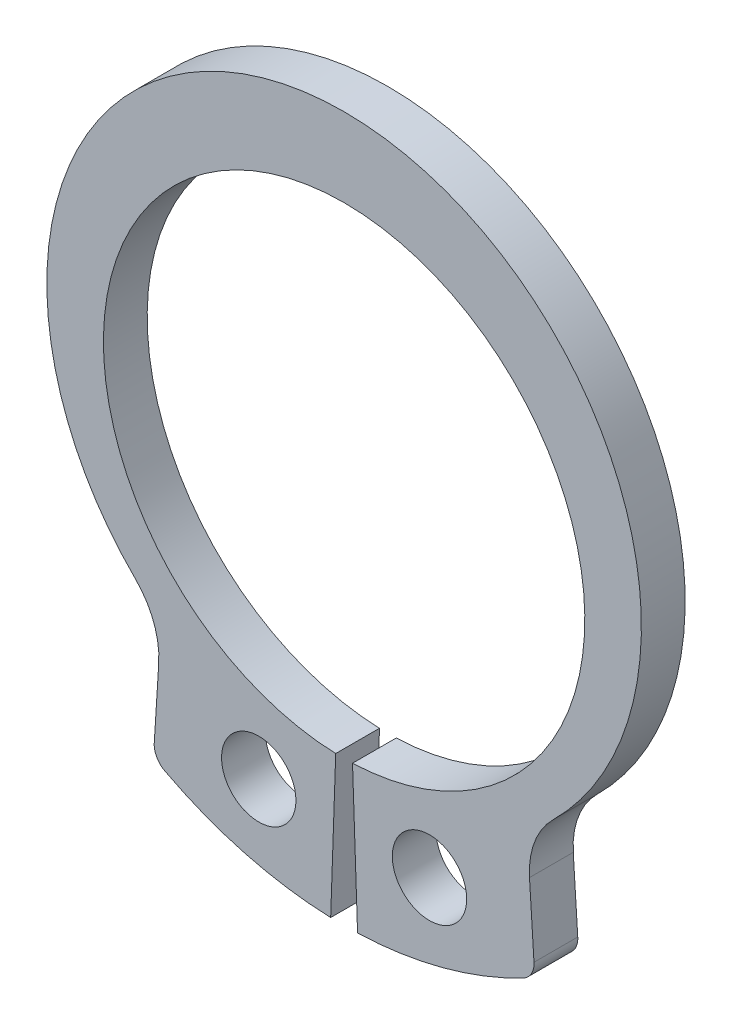
ISO-10303-21;
HEADER;
FILE_DESCRIPTION(('STEP AP214'),'2;1');
FILE_NAME('part.step','',(''),(''),'','','');
FILE_SCHEMA(('AUTOMOTIVE_DESIGN { 1 0 10303 214 1 1 1 1 }'));
ENDSEC;
DATA;
#1=APPLICATION_CONTEXT('core data for automotive mechanical design processes');
#2=APPLICATION_PROTOCOL_DEFINITION('international standard','automotive_design',2000,#1);
#3=PRODUCT_CONTEXT('',#1,'mechanical');
#4=PRODUCT('Part','Part','',(#3));
#5=PRODUCT_RELATED_PRODUCT_CATEGORY('part','',(#4));
#6=PRODUCT_DEFINITION_FORMATION('','',#4);
#7=PRODUCT_DEFINITION_CONTEXT('part definition',#1,'design');
#8=PRODUCT_DEFINITION('design','',#6,#7);
#9=PRODUCT_DEFINITION_SHAPE('','',#8);
#10=(LENGTH_UNIT() NAMED_UNIT(*) SI_UNIT(.MILLI.,.METRE.));
#11=(NAMED_UNIT(*) PLANE_ANGLE_UNIT() SI_UNIT($,.RADIAN.));
#12=(NAMED_UNIT(*) SI_UNIT($,.STERADIAN.) SOLID_ANGLE_UNIT());
#13=UNCERTAINTY_MEASURE_WITH_UNIT(LENGTH_MEASURE(1.E-05),#10,'distance_accuracy_value','');
#14=(GEOMETRIC_REPRESENTATION_CONTEXT(3) GLOBAL_UNCERTAINTY_ASSIGNED_CONTEXT((#13)) GLOBAL_UNIT_ASSIGNED_CONTEXT((#10,
#11,#12)) REPRESENTATION_CONTEXT('',''));
#15=CARTESIAN_POINT('',(0.,0.,0.));
#16=DIRECTION('',(0.,0.,1.));
#17=DIRECTION('',(1.,0.,0.));
#18=AXIS2_PLACEMENT_3D('',#15,#16,#17);
#19=CARTESIAN_POINT('',(0.,0.507545005992357,0.5));
#20=DIRECTION('',(0.,0.,1.));
#21=DIRECTION('',(1.,0.,0.));
#22=AXIS2_PLACEMENT_3D('',#19,#20,#21);
#23=PLANE('',#22);
#24=DIRECTION('',(-0.0629534404343196,-0.99801646496312,0.));
#25=VECTOR('',#24,1.);
#26=CARTESIAN_POINT('',(-4.3566053068115,-7.65208632949539,0.5));
#27=LINE('',#26,#25);
#28=CARTESIAN_POINT('',(-4.23583263948221,-5.73744735693751,0.5));
#29=VERTEX_POINT('',#28);
#30=CARTESIAN_POINT('',(-4.33832534093224,-7.36228950821608,0.5));
#31=VERTEX_POINT('',#30);
#32=EDGE_CURVE('E194',#29,#31,#27,.T.);
#33=ORIENTED_EDGE('',*,*,#32,.T.);
#34=CARTESIAN_POINT('',(-3.8826661637093,-7.39103183249498,0.5));
#35=DIRECTION('',(0.,0.,1.));
#36=DIRECTION('',(1.,0.,0.));
#37=AXIS2_PLACEMENT_3D('',#34,#35,#36);
#38=CIRCLE('',#37,0.456564789479484);
#39=CARTESIAN_POINT('',(-4.09499474140209,-7.79521988537062,0.5));
#40=VERTEX_POINT('',#39);
#41=EDGE_CURVE('E12',#31,#40,#38,.T.);
#42=ORIENTED_EDGE('',*,*,#41,.T.);
#43=CARTESIAN_POINT('',(0.,0.,0.5));
#44=DIRECTION('',(0.,0.,1.));
#45=DIRECTION('',(1.,0.,0.));
#46=AXIS2_PLACEMENT_3D('',#43,#44,#45);
#47=CIRCLE('',#46,8.80536398982963);
#48=CARTESIAN_POINT('',(-0.307302771527386,-8.8,0.5));
#49=VERTEX_POINT('',#48);
#50=EDGE_CURVE('E197',#40,#49,#47,.T.);
#51=ORIENTED_EDGE('',*,*,#50,.T.);
#52=DIRECTION('',(0.0348994967025,0.999390827019096,0.));
#53=VECTOR('',#52,1.);
#54=CARTESIAN_POINT('',(-0.307302771527386,-8.8,0.5));
#55=LINE('',#54,#53);
#56=CARTESIAN_POINT('',(-0.191947231863764,-5.49664954860503,0.5));
#57=VERTEX_POINT('',#56);
#58=EDGE_CURVE('E199',#49,#57,#55,.T.);
#59=ORIENTED_EDGE('',*,*,#58,.T.);
#60=CARTESIAN_POINT('',(0.,0.,0.5));
#61=DIRECTION('',(0.,0.,-1.));
#62=DIRECTION('',(1.,0.,0.));
#63=AXIS2_PLACEMENT_3D('',#60,#61,#62);
#64=CIRCLE('',#63,5.5);
#65=CARTESIAN_POINT('',(0.191947231863761,-5.49664954860503,0.5));
#66=VERTEX_POINT('',#65);
#67=EDGE_CURVE('E153',#57,#66,#64,.T.);
#68=ORIENTED_EDGE('',*,*,#67,.T.);
#69=DIRECTION('',(-0.0348994967024995,0.999390827019096,0.));
#70=VECTOR('',#69,1.);
#71=CARTESIAN_POINT('',(0.307302771527382,-8.8,0.5));
#72=LINE('',#71,#70);
#73=CARTESIAN_POINT('',(0.307302771527382,-8.8,0.5));
#74=VERTEX_POINT('',#73);
#75=EDGE_CURVE('E133',#74,#66,#72,.T.);
#76=ORIENTED_EDGE('',*,*,#75,.F.);
#77=CARTESIAN_POINT('',(0.,0.,0.5));
#78=DIRECTION('',(0.,0.,-1.));
#79=DIRECTION('',(-1.,0.,0.));
#80=AXIS2_PLACEMENT_3D('',#77,#78,#79);
#81=CIRCLE('',#80,8.80536398982963);
#82=CARTESIAN_POINT('',(4.09499474140209,-7.79521988537062,0.5));
#83=VERTEX_POINT('',#82);
#84=EDGE_CURVE('E143',#83,#74,#81,.T.);
#85=ORIENTED_EDGE('',*,*,#84,.F.);
#86=CARTESIAN_POINT('',(3.8826661637093,-7.39103183249498,0.5));
#87=DIRECTION('',(0.,0.,-1.));
#88=DIRECTION('',(-1.,0.,0.));
#89=AXIS2_PLACEMENT_3D('',#86,#87,#88);
#90=CIRCLE('',#89,0.456564789479484);
#91=CARTESIAN_POINT('',(4.33832534093224,-7.36228950821608,0.5));
#92=VERTEX_POINT('',#91);
#93=EDGE_CURVE('E182',#92,#83,#90,.T.);
#94=ORIENTED_EDGE('',*,*,#93,.F.);
#95=DIRECTION('',(0.0629534404343192,-0.99801646496312,0.));
#96=VECTOR('',#95,1.);
#97=CARTESIAN_POINT('',(4.3566053068115,-7.65208632949539,0.5));
#98=LINE('',#97,#96);
#99=CARTESIAN_POINT('',(4.2358326394822,-5.73744735693751,0.5));
#100=VERTEX_POINT('',#99);
#101=EDGE_CURVE('E149',#100,#92,#98,.T.);
#102=ORIENTED_EDGE('',*,*,#101,.F.);
#103=CARTESIAN_POINT('',(6.05846934837399,-5.6224780598219,0.5));
#104=DIRECTION('',(0.,0.,-1.));
#105=DIRECTION('',(-1.,0.,0.));
#106=AXIS2_PLACEMENT_3D('',#103,#104,#105);
#107=CIRCLE('',#106,1.82625915791794);
#108=CARTESIAN_POINT('',(4.77471228956015,-4.32355915325968,0.5));
#109=VERTEX_POINT('',#108);
#110=EDGE_CURVE('E173',#109,#100,#107,.F.);
#111=ORIENTED_EDGE('',*,*,#110,.F.);
#112=CARTESIAN_POINT('',(0.,0.507545005992357,0.5));
#113=DIRECTION('',(0.,0.,1.));
#114=DIRECTION('',(1.,0.,0.));
#115=AXIS2_PLACEMENT_3D('',#112,#113,#114);
#116=CIRCLE('',#115,6.79245499400762);
#117=CARTESIAN_POINT('',(-4.77471228956016,-4.32355915325968,0.5));
#118=VERTEX_POINT('',#117);
#119=EDGE_CURVE('E191',#109,#118,#116,.T.);
#120=ORIENTED_EDGE('',*,*,#119,.T.);
#121=CARTESIAN_POINT('',(-6.05846934837399,-5.6224780598219,0.5));
#122=DIRECTION('',(0.,0.,1.));
#123=DIRECTION('',(1.,0.,0.));
#124=AXIS2_PLACEMENT_3D('',#121,#122,#123);
#125=CIRCLE('',#124,1.82625915791794);
#126=EDGE_CURVE('E224',#118,#29,#125,.F.);
#127=ORIENTED_EDGE('',*,*,#126,.T.);
#128=EDGE_LOOP('',(#33,#42,#51,#59,#68,#76,#85,#94,#102,#111,#120,#127));
#129=FACE_BOUND('',#128,.T.);
#130=CARTESIAN_POINT('',(-1.95080113253433,-6.88151398034483,0.5));
#131=DIRECTION('',(0.,0.,1.));
#132=DIRECTION('',(1.,0.,0.));
#133=AXIS2_PLACEMENT_3D('',#130,#131,#132);
#134=CIRCLE('',#133,0.85);
#135=CARTESIAN_POINT('',(-1.10080113253433,-6.88151398034483,0.5));
#136=VERTEX_POINT('',#135);
#137=EDGE_CURVE('E185',#136,#136,#134,.T.);
#138=ORIENTED_EDGE('',*,*,#137,.F.);
#139=EDGE_LOOP('',(#138));
#140=FACE_BOUND('',#139,.T.);
#141=CARTESIAN_POINT('',(1.95080113253433,-6.88151398034483,0.5));
#142=DIRECTION('',(0.,0.,-1.));
#143=DIRECTION('',(-1.,0.,0.));
#144=AXIS2_PLACEMENT_3D('',#141,#142,#143);
#145=CIRCLE('',#144,0.85);
#146=CARTESIAN_POINT('',(1.10080113253433,-6.88151398034483,0.5));
#147=VERTEX_POINT('',#146);
#148=EDGE_CURVE('E163',#147,#147,#145,.T.);
#149=ORIENTED_EDGE('',*,*,#148,.T.);
#150=EDGE_LOOP('',(#149));
#151=FACE_BOUND('',#150,.T.);
#152=ADVANCED_FACE('F39',(#129,#140,#151),#23,.T.);
#153=CARTESIAN_POINT('',(0.,0.507545005992357,-0.5));
#154=DIRECTION('',(0.,0.,1.));
#155=DIRECTION('',(1.,0.,0.));
#156=AXIS2_PLACEMENT_3D('',#153,#154,#155);
#157=PLANE('',#156);
#158=CARTESIAN_POINT('',(0.,0.,-0.5));
#159=DIRECTION('',(0.,0.,1.));
#160=DIRECTION('',(1.,0.,0.));
#161=AXIS2_PLACEMENT_3D('',#158,#159,#160);
#162=CIRCLE('',#161,8.80536398982963);
#163=CARTESIAN_POINT('',(-4.09499474140209,-7.79521988537062,-0.5));
#164=VERTEX_POINT('',#163);
#165=CARTESIAN_POINT('',(-0.307302771527386,-8.8,-0.5));
#166=VERTEX_POINT('',#165);
#167=EDGE_CURVE('E207',#164,#166,#162,.T.);
#168=ORIENTED_EDGE('',*,*,#167,.F.);
#169=CARTESIAN_POINT('',(-3.8826661637093,-7.39103183249498,-0.5));
#170=DIRECTION('',(0.,0.,1.));
#171=DIRECTION('',(1.,0.,0.));
#172=AXIS2_PLACEMENT_3D('',#169,#170,#171);
#173=CIRCLE('',#172,0.456564789479484);
#174=CARTESIAN_POINT('',(-4.33832534093224,-7.36228950821608,-0.5));
#175=VERTEX_POINT('',#174);
#176=EDGE_CURVE('E61',#164,#175,#173,.F.);
#177=ORIENTED_EDGE('',*,*,#176,.T.);
#178=DIRECTION('',(-0.0629534404343196,-0.99801646496312,0.));
#179=VECTOR('',#178,1.);
#180=CARTESIAN_POINT('',(-4.3566053068115,-7.65208632949539,-0.5));
#181=LINE('',#180,#179);
#182=CARTESIAN_POINT('',(-4.23583263948221,-5.73744735693751,-0.5));
#183=VERTEX_POINT('',#182);
#184=EDGE_CURVE('E205',#183,#175,#181,.T.);
#185=ORIENTED_EDGE('',*,*,#184,.F.);
#186=CARTESIAN_POINT('',(-6.05846934837399,-5.6224780598219,-0.5));
#187=DIRECTION('',(0.,0.,1.));
#188=DIRECTION('',(1.,0.,0.));
#189=AXIS2_PLACEMENT_3D('',#186,#187,#188);
#190=CIRCLE('',#189,1.82625915791794);
#191=CARTESIAN_POINT('',(-4.77471228956016,-4.32355915325968,-0.5));
#192=VERTEX_POINT('',#191);
#193=EDGE_CURVE('E222',#183,#192,#190,.T.);
#194=ORIENTED_EDGE('',*,*,#193,.T.);
#195=CARTESIAN_POINT('',(0.,0.507545005992357,-0.5));
#196=DIRECTION('',(0.,0.,1.));
#197=DIRECTION('',(1.,0.,0.));
#198=AXIS2_PLACEMENT_3D('',#195,#196,#197);
#199=CIRCLE('',#198,6.79245499400762);
#200=CARTESIAN_POINT('',(4.77471228956015,-4.32355915325968,-0.5));
#201=VERTEX_POINT('',#200);
#202=EDGE_CURVE('E188',#201,#192,#199,.T.);
#203=ORIENTED_EDGE('',*,*,#202,.F.);
#204=CARTESIAN_POINT('',(6.05846934837399,-5.6224780598219,-0.5));
#205=DIRECTION('',(0.,0.,-1.));
#206=DIRECTION('',(-1.,0.,0.));
#207=AXIS2_PLACEMENT_3D('',#204,#205,#206);
#208=CIRCLE('',#207,1.82625915791794);
#209=CARTESIAN_POINT('',(4.2358326394822,-5.73744735693751,-0.5));
#210=VERTEX_POINT('',#209);
#211=EDGE_CURVE('E170',#210,#201,#208,.T.);
#212=ORIENTED_EDGE('',*,*,#211,.F.);
#213=DIRECTION('',(0.0629534404343192,-0.99801646496312,0.));
#214=VECTOR('',#213,1.);
#215=CARTESIAN_POINT('',(4.3566053068115,-7.65208632949539,-0.5));
#216=LINE('',#215,#214);
#217=CARTESIAN_POINT('',(4.33832534093224,-7.36228950821608,-0.5));
#218=VERTEX_POINT('',#217);
#219=EDGE_CURVE('E159',#210,#218,#216,.T.);
#220=ORIENTED_EDGE('',*,*,#219,.T.);
#221=CARTESIAN_POINT('',(3.8826661637093,-7.39103183249498,-0.5));
#222=DIRECTION('',(0.,0.,-1.));
#223=DIRECTION('',(-1.,0.,0.));
#224=AXIS2_PLACEMENT_3D('',#221,#222,#223);
#225=CIRCLE('',#224,0.456564789479484);
#226=CARTESIAN_POINT('',(4.09499474140209,-7.79521988537062,-0.5));
#227=VERTEX_POINT('',#226);
#228=EDGE_CURVE('E177',#227,#218,#225,.F.);
#229=ORIENTED_EDGE('',*,*,#228,.F.);
#230=CARTESIAN_POINT('',(0.,0.,-0.5));
#231=DIRECTION('',(0.,0.,-1.));
#232=DIRECTION('',(-1.,0.,0.));
#233=AXIS2_PLACEMENT_3D('',#230,#231,#232);
#234=CIRCLE('',#233,8.80536398982963);
#235=CARTESIAN_POINT('',(0.307302771527382,-8.8,-0.5));
#236=VERTEX_POINT('',#235);
#237=EDGE_CURVE('E162',#227,#236,#234,.T.);
#238=ORIENTED_EDGE('',*,*,#237,.T.);
#239=DIRECTION('',(-0.0348994967024995,0.999390827019096,0.));
#240=VECTOR('',#239,1.);
#241=CARTESIAN_POINT('',(0.307302771527382,-8.8,-0.5));
#242=LINE('',#241,#240);
#243=CARTESIAN_POINT('',(0.191947231863761,-5.49664954860503,-0.5));
#244=VERTEX_POINT('',#243);
#245=EDGE_CURVE('E135',#236,#244,#242,.T.);
#246=ORIENTED_EDGE('',*,*,#245,.T.);
#247=CARTESIAN_POINT('',(0.,0.,-0.5));
#248=DIRECTION('',(0.,0.,-1.));
#249=DIRECTION('',(1.,0.,0.));
#250=AXIS2_PLACEMENT_3D('',#247,#248,#249);
#251=CIRCLE('',#250,5.5);
#252=CARTESIAN_POINT('',(-0.191947231863764,-5.49664954860503,-0.5));
#253=VERTEX_POINT('',#252);
#254=EDGE_CURVE('E195',#253,#244,#251,.T.);
#255=ORIENTED_EDGE('',*,*,#254,.F.);
#256=DIRECTION('',(0.0348994967025,0.999390827019096,0.));
#257=VECTOR('',#256,1.);
#258=CARTESIAN_POINT('',(-0.307302771527386,-8.8,-0.5));
#259=LINE('',#258,#257);
#260=EDGE_CURVE('E209',#166,#253,#259,.T.);
#261=ORIENTED_EDGE('',*,*,#260,.F.);
#262=EDGE_LOOP('',(#168,#177,#185,#194,#203,#212,#220,#229,#238,#246,#255,#261));
#263=FACE_BOUND('',#262,.T.);
#264=CARTESIAN_POINT('',(-1.95080113253433,-6.88151398034483,-0.5));
#265=DIRECTION('',(0.,0.,1.));
#266=DIRECTION('',(1.,0.,0.));
#267=AXIS2_PLACEMENT_3D('',#264,#265,#266);
#268=CIRCLE('',#267,0.85);
#269=CARTESIAN_POINT('',(-1.10080113253433,-6.88151398034483,-0.5));
#270=VERTEX_POINT('',#269);
#271=EDGE_CURVE('E184',#270,#270,#268,.T.);
#272=ORIENTED_EDGE('',*,*,#271,.T.);
#273=EDGE_LOOP('',(#272));
#274=FACE_BOUND('',#273,.T.);
#275=CARTESIAN_POINT('',(1.95080113253433,-6.88151398034483,-0.5));
#276=DIRECTION('',(0.,0.,-1.));
#277=DIRECTION('',(-1.,0.,0.));
#278=AXIS2_PLACEMENT_3D('',#275,#276,#277);
#279=CIRCLE('',#278,0.85);
#280=CARTESIAN_POINT('',(1.10080113253433,-6.88151398034483,-0.5));
#281=VERTEX_POINT('',#280);
#282=EDGE_CURVE('E257',#281,#281,#279,.T.);
#283=ORIENTED_EDGE('',*,*,#282,.F.);
#284=EDGE_LOOP('',(#283));
#285=FACE_BOUND('',#284,.T.);
#286=ADVANCED_FACE('F237',(#263,#274,#285),#157,.F.);
#287=CARTESIAN_POINT('',(0.,0.507545005992357,0.5));
#288=DIRECTION('',(0.,0.,-1.));
#289=DIRECTION('',(-1.,0.,0.));
#290=AXIS2_PLACEMENT_3D('',#287,#288,#289);
#291=CYLINDRICAL_SURFACE('',#290,6.79245499400762);
#292=ORIENTED_EDGE('',*,*,#202,.T.);
#293=DIRECTION('',(0.,0.,-1.));
#294=VECTOR('',#293,1.);
#295=CARTESIAN_POINT('',(-4.77471228956016,-4.32355915325968,0.5));
#296=LINE('',#295,#294);
#297=EDGE_CURVE('E220',#192,#118,#296,.F.);
#298=ORIENTED_EDGE('',*,*,#297,.T.);
#299=ORIENTED_EDGE('',*,*,#119,.F.);
#300=DIRECTION('',(0.,0.,-1.));
#301=VECTOR('',#300,1.);
#302=CARTESIAN_POINT('',(4.77471228956015,-4.32355915325968,0.5));
#303=LINE('',#302,#301);
#304=EDGE_CURVE('E167',#201,#109,#303,.F.);
#305=ORIENTED_EDGE('',*,*,#304,.F.);
#306=EDGE_LOOP('',(#292,#298,#299,#305));
#307=FACE_BOUND('',#306,.T.);
#308=ADVANCED_FACE('F272',(#307),#291,.T.);
#309=CARTESIAN_POINT('',(-4.3566053068115,-7.65208632949539,0.5));
#310=DIRECTION('',(0.99801646496312,-0.0629534404343196,0.));
#311=DIRECTION('',(0.0629534404343196,0.99801646496312,0.));
#312=AXIS2_PLACEMENT_3D('',#309,#310,#311);
#313=PLANE('',#312);
#314=ORIENTED_EDGE('',*,*,#184,.T.);
#315=DIRECTION('',(0.,0.,-1.));
#316=VECTOR('',#315,1.);
#317=CARTESIAN_POINT('',(-4.33832534093224,-7.36228950821608,0.5));
#318=LINE('',#317,#316);
#319=EDGE_CURVE('E47',#175,#31,#318,.F.);
#320=ORIENTED_EDGE('',*,*,#319,.T.);
#321=ORIENTED_EDGE('',*,*,#32,.F.);
#322=DIRECTION('',(0.,0.,1.));
#323=VECTOR('',#322,1.);
#324=CARTESIAN_POINT('',(-4.23583263948221,-5.73744735693751,-0.5));
#325=LINE('',#324,#323);
#326=EDGE_CURVE('E217',#29,#183,#325,.F.);
#327=ORIENTED_EDGE('',*,*,#326,.T.);
#328=EDGE_LOOP('',(#314,#320,#321,#327));
#329=FACE_BOUND('',#328,.T.);
#330=ADVANCED_FACE('F278',(#329),#313,.F.);
#331=CARTESIAN_POINT('',(0.,0.,0.5));
#332=DIRECTION('',(0.,0.,-1.));
#333=DIRECTION('',(-1.,0.,0.));
#334=AXIS2_PLACEMENT_3D('',#331,#332,#333);
#335=CYLINDRICAL_SURFACE('',#334,8.80536398982963);
#336=ORIENTED_EDGE('',*,*,#50,.F.);
#337=DIRECTION('',(0.,0.,-1.));
#338=VECTOR('',#337,1.);
#339=CARTESIAN_POINT('',(-4.09499474140209,-7.79521988537062,0.5));
#340=LINE('',#339,#338);
#341=EDGE_CURVE('E226',#40,#164,#340,.T.);
#342=ORIENTED_EDGE('',*,*,#341,.T.);
#343=ORIENTED_EDGE('',*,*,#167,.T.);
#344=DIRECTION('',(0.,0.,-1.));
#345=VECTOR('',#344,1.);
#346=CARTESIAN_POINT('',(-0.307302771527386,-8.8,0.5));
#347=LINE('',#346,#345);
#348=EDGE_CURVE('E214',#49,#166,#347,.T.);
#349=ORIENTED_EDGE('',*,*,#348,.F.);
#350=EDGE_LOOP('',(#336,#342,#343,#349));
#351=FACE_BOUND('',#350,.T.);
#352=ADVANCED_FACE('F232',(#351),#335,.T.);
#353=CARTESIAN_POINT('',(-0.307302771527386,-8.8,0.5));
#354=DIRECTION('',(-0.999390827019096,0.0348994967025,0.));
#355=DIRECTION('',(-0.0348994967025,-0.999390827019096,0.));
#356=AXIS2_PLACEMENT_3D('',#353,#354,#355);
#357=PLANE('',#356);
#358=ORIENTED_EDGE('',*,*,#260,.T.);
#359=DIRECTION('',(0.,0.,-1.));
#360=VECTOR('',#359,1.);
#361=CARTESIAN_POINT('',(-0.191947231863764,-5.49664954860503,0.5));
#362=LINE('',#361,#360);
#363=EDGE_CURVE('E202',#57,#253,#362,.T.);
#364=ORIENTED_EDGE('',*,*,#363,.F.);
#365=ORIENTED_EDGE('',*,*,#58,.F.);
#366=ORIENTED_EDGE('',*,*,#348,.T.);
#367=EDGE_LOOP('',(#358,#364,#365,#366));
#368=FACE_BOUND('',#367,.T.);
#369=ADVANCED_FACE('F242',(#368),#357,.F.);
#370=CARTESIAN_POINT('',(0.,0.,0.5));
#371=DIRECTION('',(0.,0.,-1.));
#372=DIRECTION('',(-1.,0.,0.));
#373=AXIS2_PLACEMENT_3D('',#370,#371,#372);
#374=CYLINDRICAL_SURFACE('',#373,5.5);
#375=ORIENTED_EDGE('',*,*,#254,.T.);
#376=DIRECTION('',(0.,0.,-1.));
#377=VECTOR('',#376,1.);
#378=CARTESIAN_POINT('',(0.191947231863761,-5.49664954860503,0.5));
#379=LINE('',#378,#377);
#380=EDGE_CURVE('E140',#66,#244,#379,.T.);
#381=ORIENTED_EDGE('',*,*,#380,.F.);
#382=ORIENTED_EDGE('',*,*,#67,.F.);
#383=ORIENTED_EDGE('',*,*,#363,.T.);
#384=EDGE_LOOP('',(#375,#381,#382,#383));
#385=FACE_BOUND('',#384,.T.);
#386=ADVANCED_FACE('F245',(#385),#374,.F.);
#387=CARTESIAN_POINT('',(-1.95080113253433,-6.88151398034483,0.5));
#388=DIRECTION('',(0.,0.,-1.));
#389=DIRECTION('',(-1.,0.,0.));
#390=AXIS2_PLACEMENT_3D('',#387,#388,#389);
#391=CYLINDRICAL_SURFACE('',#390,0.85);
#392=ORIENTED_EDGE('',*,*,#137,.T.);
#393=EDGE_LOOP('',(#392));
#394=FACE_BOUND('',#393,.T.);
#395=ORIENTED_EDGE('',*,*,#271,.F.);
#396=EDGE_LOOP('',(#395));
#397=FACE_BOUND('',#396,.T.);
#398=ADVANCED_FACE('F286',(#394,#397),#391,.F.);
#399=CARTESIAN_POINT('',(-6.05846934837399,-5.6224780598219,0.5));
#400=DIRECTION('',(0.,0.,-1.));
#401=DIRECTION('',(-1.,0.,0.));
#402=AXIS2_PLACEMENT_3D('',#399,#400,#401);
#403=CYLINDRICAL_SURFACE('',#402,1.82625915791794);
#404=ORIENTED_EDGE('',*,*,#126,.F.);
#405=ORIENTED_EDGE('',*,*,#297,.F.);
#406=ORIENTED_EDGE('',*,*,#193,.F.);
#407=ORIENTED_EDGE('',*,*,#326,.F.);
#408=EDGE_LOOP('',(#404,#405,#406,#407));
#409=FACE_BOUND('',#408,.T.);
#410=ADVANCED_FACE('F292',(#409),#403,.F.);
#411=CARTESIAN_POINT('',(-3.8826661637093,-7.39103183249498,0.5));
#412=DIRECTION('',(0.,0.,-1.));
#413=DIRECTION('',(-1.,0.,0.));
#414=AXIS2_PLACEMENT_3D('',#411,#412,#413);
#415=CYLINDRICAL_SURFACE('',#414,0.456564789479484);
#416=ORIENTED_EDGE('',*,*,#41,.F.);
#417=ORIENTED_EDGE('',*,*,#319,.F.);
#418=ORIENTED_EDGE('',*,*,#176,.F.);
#419=ORIENTED_EDGE('',*,*,#341,.F.);
#420=EDGE_LOOP('',(#416,#417,#418,#419));
#421=FACE_BOUND('',#420,.T.);
#422=ADVANCED_FACE('F41',(#421),#415,.T.);
#423=CARTESIAN_POINT('',(4.3566053068115,-7.65208632949539,0.5));
#424=DIRECTION('',(-0.99801646496312,-0.0629534404343192,0.));
#425=DIRECTION('',(-0.0629534404343192,0.99801646496312,0.));
#426=AXIS2_PLACEMENT_3D('',#423,#424,#425);
#427=PLANE('',#426);
#428=ORIENTED_EDGE('',*,*,#219,.F.);
#429=DIRECTION('',(0.,0.,1.));
#430=VECTOR('',#429,1.);
#431=CARTESIAN_POINT('',(4.2358326394822,-5.73744735693751,-0.5));
#432=LINE('',#431,#430);
#433=EDGE_CURVE('E139',#100,#210,#432,.F.);
#434=ORIENTED_EDGE('',*,*,#433,.F.);
#435=ORIENTED_EDGE('',*,*,#101,.T.);
#436=DIRECTION('',(0.,0.,-1.));
#437=VECTOR('',#436,1.);
#438=CARTESIAN_POINT('',(4.33832534093224,-7.36228950821608,0.5));
#439=LINE('',#438,#437);
#440=EDGE_CURVE('E180',#218,#92,#439,.F.);
#441=ORIENTED_EDGE('',*,*,#440,.F.);
#442=EDGE_LOOP('',(#428,#434,#435,#441));
#443=FACE_BOUND('',#442,.T.);
#444=ADVANCED_FACE('F255',(#443),#427,.F.);
#445=CARTESIAN_POINT('',(0.,0.,0.5));
#446=DIRECTION('',(0.,0.,-1.));
#447=DIRECTION('',(1.,0.,0.));
#448=AXIS2_PLACEMENT_3D('',#445,#446,#447);
#449=CYLINDRICAL_SURFACE('',#448,8.80536398982963);
#450=ORIENTED_EDGE('',*,*,#84,.T.);
#451=DIRECTION('',(0.,0.,-1.));
#452=VECTOR('',#451,1.);
#453=CARTESIAN_POINT('',(0.307302771527382,-8.8,0.5));
#454=LINE('',#453,#452);
#455=EDGE_CURVE('E128',#74,#236,#454,.T.);
#456=ORIENTED_EDGE('',*,*,#455,.T.);
#457=ORIENTED_EDGE('',*,*,#237,.F.);
#458=DIRECTION('',(0.,0.,-1.));
#459=VECTOR('',#458,1.);
#460=CARTESIAN_POINT('',(4.09499474140209,-7.79521988537062,0.5));
#461=LINE('',#460,#459);
#462=EDGE_CURVE('E145',#83,#227,#461,.T.);
#463=ORIENTED_EDGE('',*,*,#462,.F.);
#464=EDGE_LOOP('',(#450,#456,#457,#463));
#465=FACE_BOUND('',#464,.T.);
#466=ADVANCED_FACE('F144',(#465),#449,.T.);
#467=CARTESIAN_POINT('',(0.307302771527382,-8.8,0.5));
#468=DIRECTION('',(0.999390827019096,0.0348994967024995,0.));
#469=DIRECTION('',(0.0348994967024995,-0.999390827019096,0.));
#470=AXIS2_PLACEMENT_3D('',#467,#468,#469);
#471=PLANE('',#470);
#472=ORIENTED_EDGE('',*,*,#245,.F.);
#473=ORIENTED_EDGE('',*,*,#455,.F.);
#474=ORIENTED_EDGE('',*,*,#75,.T.);
#475=ORIENTED_EDGE('',*,*,#380,.T.);
#476=EDGE_LOOP('',(#472,#473,#474,#475));
#477=FACE_BOUND('',#476,.T.);
#478=ADVANCED_FACE('F130',(#477),#471,.F.);
#479=CARTESIAN_POINT('',(1.95080113253433,-6.88151398034483,0.5));
#480=DIRECTION('',(0.,0.,-1.));
#481=DIRECTION('',(1.,0.,0.));
#482=AXIS2_PLACEMENT_3D('',#479,#480,#481);
#483=CYLINDRICAL_SURFACE('',#482,0.85);
#484=ORIENTED_EDGE('',*,*,#148,.F.);
#485=EDGE_LOOP('',(#484));
#486=FACE_BOUND('',#485,.T.);
#487=ORIENTED_EDGE('',*,*,#282,.T.);
#488=EDGE_LOOP('',(#487));
#489=FACE_BOUND('',#488,.T.);
#490=ADVANCED_FACE('F264',(#486,#489),#483,.F.);
#491=CARTESIAN_POINT('',(6.05846934837399,-5.6224780598219,0.5));
#492=DIRECTION('',(0.,0.,-1.));
#493=DIRECTION('',(1.,0.,0.));
#494=AXIS2_PLACEMENT_3D('',#491,#492,#493);
#495=CYLINDRICAL_SURFACE('',#494,1.82625915791794);
#496=ORIENTED_EDGE('',*,*,#110,.T.);
#497=ORIENTED_EDGE('',*,*,#433,.T.);
#498=ORIENTED_EDGE('',*,*,#211,.T.);
#499=ORIENTED_EDGE('',*,*,#304,.T.);
#500=EDGE_LOOP('',(#496,#497,#498,#499));
#501=FACE_BOUND('',#500,.T.);
#502=ADVANCED_FACE('F267',(#501),#495,.F.);
#503=CARTESIAN_POINT('',(3.8826661637093,-7.39103183249498,0.5));
#504=DIRECTION('',(0.,0.,-1.));
#505=DIRECTION('',(1.,0.,0.));
#506=AXIS2_PLACEMENT_3D('',#503,#504,#505);
#507=CYLINDRICAL_SURFACE('',#506,0.456564789479484);
#508=ORIENTED_EDGE('',*,*,#93,.T.);
#509=ORIENTED_EDGE('',*,*,#462,.T.);
#510=ORIENTED_EDGE('',*,*,#228,.T.);
#511=ORIENTED_EDGE('',*,*,#440,.T.);
#512=EDGE_LOOP('',(#508,#509,#510,#511));
#513=FACE_BOUND('',#512,.T.);
#514=ADVANCED_FACE('F250',(#513),#507,.T.);
#515=CLOSED_SHELL('',(#152,#286,#308,#330,#352,#369,#386,#398,#410,#422,#444,#466,#478,#490,
#502,#514));
#516=MANIFOLD_SOLID_BREP('B2',#515);
#517=ADVANCED_BREP_SHAPE_REPRESENTATION('',(#18,#516),#14);
#518=SHAPE_DEFINITION_REPRESENTATION(#9,#517);
ENDSEC;
END-ISO-10303-21;
